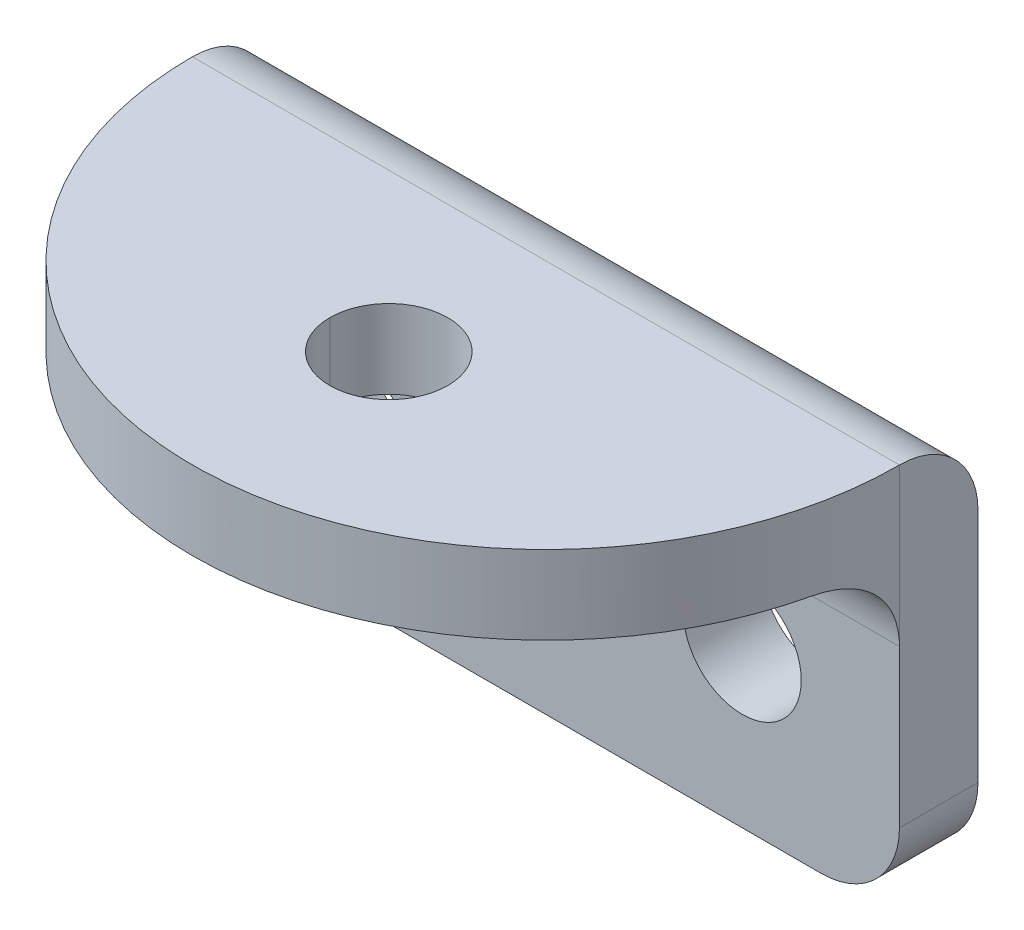
ISO-10303-21;
HEADER;
FILE_DESCRIPTION(('STEP AP214'),'2;1');
FILE_NAME('part.step','',(''),(''),'','','');
FILE_SCHEMA(('AUTOMOTIVE_DESIGN { 1 0 10303 214 1 1 1 1 }'));
ENDSEC;
DATA;
#1=APPLICATION_CONTEXT('core data for automotive mechanical design processes');
#2=APPLICATION_PROTOCOL_DEFINITION('international standard','automotive_design',2000,#1);
#3=PRODUCT_CONTEXT('',#1,'mechanical');
#4=PRODUCT('Part','Part','',(#3));
#5=PRODUCT_RELATED_PRODUCT_CATEGORY('part','',(#4));
#6=PRODUCT_DEFINITION_FORMATION('','',#4);
#7=PRODUCT_DEFINITION_CONTEXT('part definition',#1,'design');
#8=PRODUCT_DEFINITION('design','',#6,#7);
#9=PRODUCT_DEFINITION_SHAPE('','',#8);
#10=(LENGTH_UNIT() NAMED_UNIT(*) SI_UNIT(.MILLI.,.METRE.));
#11=(NAMED_UNIT(*) PLANE_ANGLE_UNIT() SI_UNIT($,.RADIAN.));
#12=(NAMED_UNIT(*) SI_UNIT($,.STERADIAN.) SOLID_ANGLE_UNIT());
#13=UNCERTAINTY_MEASURE_WITH_UNIT(LENGTH_MEASURE(1.E-05),#10,'distance_accuracy_value','');
#14=(GEOMETRIC_REPRESENTATION_CONTEXT(3) GLOBAL_UNCERTAINTY_ASSIGNED_CONTEXT((#13)) GLOBAL_UNIT_ASSIGNED_CONTEXT((#10,
#11,#12)) REPRESENTATION_CONTEXT('',''));
#15=CARTESIAN_POINT('',(0.,0.,0.));
#16=DIRECTION('',(0.,0.,1.));
#17=DIRECTION('',(1.,0.,0.));
#18=AXIS2_PLACEMENT_3D('',#15,#16,#17);
#19=CARTESIAN_POINT('',(0.,1.,0.));
#20=DIRECTION('',(0.,-1.,0.));
#21=DIRECTION('',(-1.,0.,0.));
#22=AXIS2_PLACEMENT_3D('',#19,#20,#21);
#23=CYLINDRICAL_SURFACE('',#22,9.);
#24=DIRECTION('',(0.,1.,0.));
#25=VECTOR('',#24,1.);
#26=CARTESIAN_POINT('',(-9.,1.,0.));
#27=LINE('',#26,#25);
#28=CARTESIAN_POINT('',(-9.,0.,0.));
#29=VERTEX_POINT('',#28);
#30=CARTESIAN_POINT('',(-9.,2.,0.));
#31=VERTEX_POINT('',#30);
#32=EDGE_CURVE('E139',#29,#31,#27,.T.);
#33=ORIENTED_EDGE('',*,*,#32,.F.);
#34=DIRECTION('',(0.,1.,0.));
#35=VECTOR('',#34,1.);
#36=CARTESIAN_POINT('',(-9.,-1.,0.));
#37=LINE('',#36,#35);
#38=CARTESIAN_POINT('',(-9.,-2.,0.));
#39=VERTEX_POINT('',#38);
#40=EDGE_CURVE('E142',#39,#29,#37,.T.);
#41=ORIENTED_EDGE('',*,*,#40,.F.);
#42=CARTESIAN_POINT('',(-9.,-2.,0.));
#43=CARTESIAN_POINT('',(-9.,-1.9408877817452,0.));
#44=CARTESIAN_POINT('',(-9.,-1.88177560209684,0.0021839089663973));
#45=CARTESIAN_POINT('',(-9.00000000467806,-1.82263673670032,0.00656366658157698));
#46=CARTESIAN_POINT('',(-8.99997753457232,-1.57537855117304,0.034102446830845));
#47=CARTESIAN_POINT('',(-8.99967613510836,-1.33381061421436,0.0998515414256871));
#48=CARTESIAN_POINT('',(-8.99894898717721,-1.15647216478804,0.171654970265387));
#49=CARTESIAN_POINT('',(-8.99466662045107,-0.821669913973436,0.356202372967077));
#50=CARTESIAN_POINT('',(-8.98054347110023,-0.539485062151362,0.61379829650161));
#51=CARTESIAN_POINT('',(-8.96995565845624,-0.414300831091176,0.758999824340353));
#52=CARTESIAN_POINT('',(-8.93928077081571,-0.199738499250201,1.07797120798916));
#53=CARTESIAN_POINT('',(-8.88754966926456,-0.0667548559579321,1.43632848880386));
#54=CARTESIAN_POINT('',(-8.8555939857781,-0.0220702444719247,1.62302236368879));
#55=CARTESIAN_POINT('',(-8.81779436107367,0.,1.8120842531157));
#56=CARTESIAN_POINT('',(-8.77496438739213,0.,2.));
#57=(BOUNDED_CURVE() B_SPLINE_CURVE(5,(#42,#43,#44,#45,#46,#47,#48,#49,#50,#51,#52,#53,#54,#55,
#56),.UNSPECIFIED.,.F.,.F.) B_SPLINE_CURVE_WITH_KNOTS((6,3,3,3,6),(-4.4652797792335,
-4.04729327544405,-2.70728797744066,-1.36284141727212,0.),
.UNSPECIFIED.) CURVE() GEOMETRIC_REPRESENTATION_ITEM() RATIONAL_B_SPLINE_CURVE((1.,1.,1.,1.,1.,
1.,1.,1.,1.,1.,1.,1.,1.,1.,1.)) REPRESENTATION_ITEM(''));
#58=CARTESIAN_POINT('',(-8.77496438739212,0.,2.));
#59=VERTEX_POINT('',#58);
#60=EDGE_CURVE('E28',#39,#59,#57,.T.);
#61=ORIENTED_EDGE('',*,*,#60,.T.);
#62=CARTESIAN_POINT('',(0.,0.,0.));
#63=DIRECTION('',(0.,1.,0.));
#64=DIRECTION('',(-1.,0.,0.));
#65=AXIS2_PLACEMENT_3D('',#62,#63,#64);
#66=CIRCLE('',#65,9.);
#67=CARTESIAN_POINT('',(8.77496438739212,0.,2.));
#68=VERTEX_POINT('',#67);
#69=EDGE_CURVE('E180',#59,#68,#66,.T.);
#70=ORIENTED_EDGE('',*,*,#69,.T.);
#71=CARTESIAN_POINT('',(8.77496438739212,0.,2.));
#72=CARTESIAN_POINT('',(8.8177943610738,0.,1.8120842531151));
#73=CARTESIAN_POINT('',(8.85559398577836,-0.0220702444720659,1.62302236368759));
#74=CARTESIAN_POINT('',(8.88754966926438,-0.0667548559575057,1.43632848880501));
#75=CARTESIAN_POINT('',(8.93928077081591,-0.199738499250488,1.07797120798797));
#76=CARTESIAN_POINT('',(8.96995565845653,-0.414300831093213,0.758999824337327));
#77=CARTESIAN_POINT('',(8.98054347110009,-0.539485062148762,0.613798296504025));
#78=CARTESIAN_POINT('',(8.99466662045122,-0.821669913974984,0.356202372965046));
#79=CARTESIAN_POINT('',(8.99894898717729,-1.15647216479585,0.17165497026109));
#80=CARTESIAN_POINT('',(8.99967613510837,-1.33381061420597,0.0998515414280107));
#81=CARTESIAN_POINT('',(8.99997753457232,-1.57537855116867,0.0341024468313249));
#82=CARTESIAN_POINT('',(9.00000000467806,-1.82263673670033,0.00656366658157823));
#83=CARTESIAN_POINT('',(9.,-1.88177560209685,0.00218390896639929));
#84=CARTESIAN_POINT('',(9.,-1.9408877817452,0.));
#85=CARTESIAN_POINT('',(9.,-2.,0.));
#86=(BOUNDED_CURVE() B_SPLINE_CURVE(5,(#71,#72,#73,#74,#75,#76,#77,#78,#79,#80,#81,#82,#83,#84,
#85),.UNSPECIFIED.,.F.,.F.) B_SPLINE_CURVE_WITH_KNOTS((6,3,3,3,6),(0.,1.36284141727647,
2.70728797745785,4.04729327549215,4.46527977928159),
.UNSPECIFIED.) CURVE() GEOMETRIC_REPRESENTATION_ITEM() RATIONAL_B_SPLINE_CURVE((1.,1.,1.,1.,1.,
1.,1.,1.,1.,1.,1.,1.,1.,1.,1.)) REPRESENTATION_ITEM(''));
#87=CARTESIAN_POINT('',(9.,-2.,0.));
#88=VERTEX_POINT('',#87);
#89=EDGE_CURVE('E10',#68,#88,#86,.T.);
#90=ORIENTED_EDGE('',*,*,#89,.T.);
#91=DIRECTION('',(0.,-1.,0.));
#92=VECTOR('',#91,1.);
#93=CARTESIAN_POINT('',(9.,-1.,0.));
#94=LINE('',#93,#92);
#95=CARTESIAN_POINT('',(9.,0.,0.));
#96=VERTEX_POINT('',#95);
#97=EDGE_CURVE('E209',#96,#88,#94,.T.);
#98=ORIENTED_EDGE('',*,*,#97,.F.);
#99=DIRECTION('',(0.,1.,0.));
#100=VECTOR('',#99,1.);
#101=CARTESIAN_POINT('',(9.,1.,0.));
#102=LINE('',#101,#100);
#103=CARTESIAN_POINT('',(9.,2.,0.));
#104=VERTEX_POINT('',#103);
#105=EDGE_CURVE('E213',#96,#104,#102,.T.);
#106=ORIENTED_EDGE('',*,*,#105,.T.);
#107=CARTESIAN_POINT('',(0.,2.,0.));
#108=DIRECTION('',(0.,1.,0.));
#109=DIRECTION('',(-1.,0.,0.));
#110=AXIS2_PLACEMENT_3D('',#107,#108,#109);
#111=CIRCLE('',#110,9.);
#112=EDGE_CURVE('E145',#31,#104,#111,.T.);
#113=ORIENTED_EDGE('',*,*,#112,.F.);
#114=EDGE_LOOP('',(#33,#41,#61,#70,#90,#98,#106,#113));
#115=FACE_BOUND('',#114,.T.);
#116=ADVANCED_FACE('F17',(#115),#23,.T.);
#117=CARTESIAN_POINT('',(0.,-2.,2.));
#118=DIRECTION('',(-1.,0.,0.));
#119=DIRECTION('',(0.,1.,0.));
#120=AXIS2_PLACEMENT_3D('',#117,#118,#119);
#121=CYLINDRICAL_SURFACE('',#120,2.);
#122=DIRECTION('',(1.,0.,0.));
#123=VECTOR('',#122,1.);
#124=CARTESIAN_POINT('',(0.,0.,2.));
#125=LINE('',#124,#123);
#126=EDGE_CURVE('E177',#59,#68,#125,.T.);
#127=ORIENTED_EDGE('',*,*,#126,.F.);
#128=ORIENTED_EDGE('',*,*,#60,.F.);
#129=DIRECTION('',(1.,0.,0.));
#130=VECTOR('',#129,1.);
#131=CARTESIAN_POINT('',(0.,-2.,0.));
#132=LINE('',#131,#130);
#133=EDGE_CURVE('E182',#39,#88,#132,.T.);
#134=ORIENTED_EDGE('',*,*,#133,.T.);
#135=ORIENTED_EDGE('',*,*,#89,.F.);
#136=EDGE_LOOP('',(#127,#128,#134,#135));
#137=FACE_BOUND('',#136,.T.);
#138=ADVANCED_FACE('F367',(#137),#121,.F.);
#139=CARTESIAN_POINT('',(-9.,0.,0.));
#140=DIRECTION('',(0.,0.,1.));
#141=DIRECTION('',(1.,0.,0.));
#142=AXIS2_PLACEMENT_3D('',#139,#140,#141);
#143=PLANE('',#142);
#144=CARTESIAN_POINT('',(-5.,-4.,0.));
#145=DIRECTION('',(0.,0.,1.));
#146=DIRECTION('',(1.,0.,0.));
#147=AXIS2_PLACEMENT_3D('',#144,#145,#146);
#148=CIRCLE('',#147,1.5);
#149=CARTESIAN_POINT('',(-3.5,-4.,0.));
#150=VERTEX_POINT('',#149);
#151=CARTESIAN_POINT('',(-6.5,-4.,0.));
#152=VERTEX_POINT('',#151);
#153=EDGE_CURVE('E250',#150,#152,#148,.T.);
#154=ORIENTED_EDGE('',*,*,#153,.F.);
#155=CARTESIAN_POINT('',(-5.,-4.,0.));
#156=DIRECTION('',(0.,0.,1.));
#157=DIRECTION('',(1.,0.,0.));
#158=AXIS2_PLACEMENT_3D('',#155,#156,#157);
#159=CIRCLE('',#158,1.5);
#160=EDGE_CURVE('E268',#152,#150,#159,.T.);
#161=ORIENTED_EDGE('',*,*,#160,.F.);
#162=EDGE_LOOP('',(#154,#161));
#163=FACE_BOUND('',#162,.T.);
#164=CARTESIAN_POINT('',(5.,-4.,0.));
#165=DIRECTION('',(0.,0.,1.));
#166=DIRECTION('',(1.,0.,0.));
#167=AXIS2_PLACEMENT_3D('',#164,#165,#166);
#168=CIRCLE('',#167,1.5);
#169=CARTESIAN_POINT('',(6.5,-4.,0.));
#170=VERTEX_POINT('',#169);
#171=CARTESIAN_POINT('',(3.5,-4.,0.));
#172=VERTEX_POINT('',#171);
#173=EDGE_CURVE('E281',#170,#172,#168,.T.);
#174=ORIENTED_EDGE('',*,*,#173,.F.);
#175=CARTESIAN_POINT('',(5.,-4.,0.));
#176=DIRECTION('',(0.,0.,1.));
#177=DIRECTION('',(1.,0.,0.));
#178=AXIS2_PLACEMENT_3D('',#175,#176,#177);
#179=CIRCLE('',#178,1.5);
#180=EDGE_CURVE('E306',#172,#170,#179,.T.);
#181=ORIENTED_EDGE('',*,*,#180,.F.);
#182=EDGE_LOOP('',(#174,#181));
#183=FACE_BOUND('',#182,.T.);
#184=DIRECTION('',(0.,-1.,0.));
#185=VECTOR('',#184,1.);
#186=CARTESIAN_POINT('',(-9.,-4.,0.));
#187=LINE('',#186,#185);
#188=CARTESIAN_POINT('',(-9.,-6.,0.));
#189=VERTEX_POINT('',#188);
#190=EDGE_CURVE('E156',#39,#189,#187,.T.);
#191=ORIENTED_EDGE('',*,*,#190,.T.);
#192=CARTESIAN_POINT('',(-7.,-6.,0.));
#193=DIRECTION('',(0.,0.,-1.));
#194=DIRECTION('',(1.,0.,0.));
#195=AXIS2_PLACEMENT_3D('',#192,#193,#194);
#196=CIRCLE('',#195,2.);
#197=CARTESIAN_POINT('',(-7.,-8.,0.));
#198=VERTEX_POINT('',#197);
#199=EDGE_CURVE('E174',#198,#189,#196,.T.);
#200=ORIENTED_EDGE('',*,*,#199,.F.);
#201=DIRECTION('',(1.,0.,0.));
#202=VECTOR('',#201,1.);
#203=CARTESIAN_POINT('',(0.,-8.,0.));
#204=LINE('',#203,#202);
#205=CARTESIAN_POINT('',(7.,-8.,0.));
#206=VERTEX_POINT('',#205);
#207=EDGE_CURVE('E300',#198,#206,#204,.T.);
#208=ORIENTED_EDGE('',*,*,#207,.T.);
#209=CARTESIAN_POINT('',(7.,-6.,0.));
#210=DIRECTION('',(0.,0.,-1.));
#211=DIRECTION('',(1.,0.,0.));
#212=AXIS2_PLACEMENT_3D('',#209,#210,#211);
#213=CIRCLE('',#212,2.);
#214=CARTESIAN_POINT('',(9.,-6.,0.));
#215=VERTEX_POINT('',#214);
#216=EDGE_CURVE('E230',#215,#206,#213,.T.);
#217=ORIENTED_EDGE('',*,*,#216,.F.);
#218=DIRECTION('',(0.,-1.,0.));
#219=VECTOR('',#218,1.);
#220=CARTESIAN_POINT('',(9.,-4.,0.));
#221=LINE('',#220,#219);
#222=EDGE_CURVE('E206',#88,#215,#221,.T.);
#223=ORIENTED_EDGE('',*,*,#222,.F.);
#224=ORIENTED_EDGE('',*,*,#133,.F.);
#225=EDGE_LOOP('',(#191,#200,#208,#217,#223,#224));
#226=FACE_BOUND('',#225,.T.);
#227=ADVANCED_FACE('F359',(#163,#183,#226),#143,.T.);
#228=CARTESIAN_POINT('',(0.,0.,0.));
#229=DIRECTION('',(0.,1.,0.));
#230=DIRECTION('',(-1.,0.,0.));
#231=AXIS2_PLACEMENT_3D('',#228,#229,#230);
#232=PLANE('',#231);
#233=CARTESIAN_POINT('',(0.,0.,4.));
#234=DIRECTION('',(0.,1.,0.));
#235=DIRECTION('',(-1.,0.,0.));
#236=AXIS2_PLACEMENT_3D('',#233,#234,#235);
#237=CIRCLE('',#236,1.5);
#238=CARTESIAN_POINT('',(-1.5,0.,4.));
#239=VERTEX_POINT('',#238);
#240=CARTESIAN_POINT('',(1.5,0.,4.));
#241=VERTEX_POINT('',#240);
#242=EDGE_CURVE('E262',#239,#241,#237,.T.);
#243=ORIENTED_EDGE('',*,*,#242,.T.);
#244=CARTESIAN_POINT('',(0.,0.,4.));
#245=DIRECTION('',(0.,1.,0.));
#246=DIRECTION('',(-1.,0.,0.));
#247=AXIS2_PLACEMENT_3D('',#244,#245,#246);
#248=CIRCLE('',#247,1.5);
#249=EDGE_CURVE('E267',#241,#239,#248,.T.);
#250=ORIENTED_EDGE('',*,*,#249,.T.);
#251=EDGE_LOOP('',(#243,#250));
#252=FACE_BOUND('',#251,.T.);
#253=ORIENTED_EDGE('',*,*,#126,.T.);
#254=ORIENTED_EDGE('',*,*,#69,.F.);
#255=EDGE_LOOP('',(#253,#254));
#256=FACE_BOUND('',#255,.T.);
#257=ADVANCED_FACE('F366',(#252,#256),#232,.F.);
#258=CARTESIAN_POINT('',(-7.,-6.,-1.));
#259=DIRECTION('',(0.,0.,-1.));
#260=DIRECTION('',(0.,-1.,0.));
#261=AXIS2_PLACEMENT_3D('',#258,#259,#260);
#262=CYLINDRICAL_SURFACE('',#261,2.);
#263=ORIENTED_EDGE('',*,*,#199,.T.);
#264=DIRECTION('',(0.,0.,1.));
#265=VECTOR('',#264,1.);
#266=CARTESIAN_POINT('',(-9.,-6.,-1.));
#267=LINE('',#266,#265);
#268=CARTESIAN_POINT('',(-9.,-6.,-2.));
#269=VERTEX_POINT('',#268);
#270=EDGE_CURVE('E163',#269,#189,#267,.T.);
#271=ORIENTED_EDGE('',*,*,#270,.F.);
#272=CARTESIAN_POINT('',(-7.,-6.,-2.));
#273=DIRECTION('',(0.,0.,1.));
#274=DIRECTION('',(1.,0.,0.));
#275=AXIS2_PLACEMENT_3D('',#272,#273,#274);
#276=CIRCLE('',#275,2.);
#277=CARTESIAN_POINT('',(-7.,-8.,-2.));
#278=VERTEX_POINT('',#277);
#279=EDGE_CURVE('E171',#269,#278,#276,.T.);
#280=ORIENTED_EDGE('',*,*,#279,.T.);
#281=DIRECTION('',(0.,0.,1.));
#282=VECTOR('',#281,1.);
#283=CARTESIAN_POINT('',(-7.,-8.,-1.));
#284=LINE('',#283,#282);
#285=EDGE_CURVE('E199',#278,#198,#284,.T.);
#286=ORIENTED_EDGE('',*,*,#285,.T.);
#287=EDGE_LOOP('',(#263,#271,#280,#286));
#288=FACE_BOUND('',#287,.T.);
#289=ADVANCED_FACE('F377',(#288),#262,.T.);
#290=CARTESIAN_POINT('',(-9.,2.,-2.));
#291=DIRECTION('',(0.,0.,-1.));
#292=DIRECTION('',(1.,0.,0.));
#293=AXIS2_PLACEMENT_3D('',#290,#291,#292);
#294=PLANE('',#293);
#295=CARTESIAN_POINT('',(-5.,-4.,-2.));
#296=DIRECTION('',(0.,0.,-1.));
#297=DIRECTION('',(1.,0.,0.));
#298=AXIS2_PLACEMENT_3D('',#295,#296,#297);
#299=CIRCLE('',#298,1.5);
#300=CARTESIAN_POINT('',(-6.5,-4.,-2.));
#301=VERTEX_POINT('',#300);
#302=CARTESIAN_POINT('',(-3.5,-4.,-2.));
#303=VERTEX_POINT('',#302);
#304=EDGE_CURVE('E254',#301,#303,#299,.T.);
#305=ORIENTED_EDGE('',*,*,#304,.F.);
#306=CARTESIAN_POINT('',(-5.,-4.,-2.));
#307=DIRECTION('',(0.,0.,-1.));
#308=DIRECTION('',(1.,0.,0.));
#309=AXIS2_PLACEMENT_3D('',#306,#307,#308);
#310=CIRCLE('',#309,1.5);
#311=EDGE_CURVE('E292',#303,#301,#310,.T.);
#312=ORIENTED_EDGE('',*,*,#311,.F.);
#313=EDGE_LOOP('',(#305,#312));
#314=FACE_BOUND('',#313,.T.);
#315=CARTESIAN_POINT('',(5.,-4.,-2.));
#316=DIRECTION('',(0.,0.,-1.));
#317=DIRECTION('',(1.,0.,0.));
#318=AXIS2_PLACEMENT_3D('',#315,#316,#317);
#319=CIRCLE('',#318,1.5);
#320=CARTESIAN_POINT('',(3.5,-4.,-2.));
#321=VERTEX_POINT('',#320);
#322=CARTESIAN_POINT('',(6.5,-4.,-2.));
#323=VERTEX_POINT('',#322);
#324=EDGE_CURVE('E285',#321,#323,#319,.T.);
#325=ORIENTED_EDGE('',*,*,#324,.F.);
#326=CARTESIAN_POINT('',(5.,-4.,-2.));
#327=DIRECTION('',(0.,0.,-1.));
#328=DIRECTION('',(1.,0.,0.));
#329=AXIS2_PLACEMENT_3D('',#326,#327,#328);
#330=CIRCLE('',#329,1.5);
#331=EDGE_CURVE('E318',#323,#321,#330,.T.);
#332=ORIENTED_EDGE('',*,*,#331,.F.);
#333=EDGE_LOOP('',(#325,#332));
#334=FACE_BOUND('',#333,.T.);
#335=DIRECTION('',(0.,-1.,0.));
#336=VECTOR('',#335,1.);
#337=CARTESIAN_POINT('',(-9.,-3.,-2.));
#338=LINE('',#337,#336);
#339=CARTESIAN_POINT('',(-9.,0.,-2.));
#340=VERTEX_POINT('',#339);
#341=EDGE_CURVE('E150',#340,#269,#338,.T.);
#342=ORIENTED_EDGE('',*,*,#341,.F.);
#343=DIRECTION('',(-1.,0.,0.));
#344=VECTOR('',#343,1.);
#345=CARTESIAN_POINT('',(0.,0.,-2.));
#346=LINE('',#345,#344);
#347=CARTESIAN_POINT('',(9.,0.,-2.));
#348=VERTEX_POINT('',#347);
#349=EDGE_CURVE('E195',#348,#340,#346,.T.);
#350=ORIENTED_EDGE('',*,*,#349,.F.);
#351=DIRECTION('',(0.,-1.,0.));
#352=VECTOR('',#351,1.);
#353=CARTESIAN_POINT('',(9.,-3.,-2.));
#354=LINE('',#353,#352);
#355=CARTESIAN_POINT('',(9.,-6.,-2.));
#356=VERTEX_POINT('',#355);
#357=EDGE_CURVE('E203',#348,#356,#354,.T.);
#358=ORIENTED_EDGE('',*,*,#357,.T.);
#359=CARTESIAN_POINT('',(7.,-6.,-2.));
#360=DIRECTION('',(0.,0.,1.));
#361=DIRECTION('',(1.,0.,0.));
#362=AXIS2_PLACEMENT_3D('',#359,#360,#361);
#363=CIRCLE('',#362,2.);
#364=CARTESIAN_POINT('',(7.,-8.,-2.));
#365=VERTEX_POINT('',#364);
#366=EDGE_CURVE('E243',#365,#356,#363,.T.);
#367=ORIENTED_EDGE('',*,*,#366,.F.);
#368=DIRECTION('',(-1.,0.,0.));
#369=VECTOR('',#368,1.);
#370=CARTESIAN_POINT('',(0.,-8.,-2.));
#371=LINE('',#370,#369);
#372=EDGE_CURVE('E167',#365,#278,#371,.T.);
#373=ORIENTED_EDGE('',*,*,#372,.T.);
#374=ORIENTED_EDGE('',*,*,#279,.F.);
#375=EDGE_LOOP('',(#342,#350,#358,#367,#373,#374));
#376=FACE_BOUND('',#375,.T.);
#377=ADVANCED_FACE('F339',(#314,#334,#376),#294,.T.);
#378=CARTESIAN_POINT('',(-9.,2.,-2.));
#379=DIRECTION('',(1.,0.,0.));
#380=DIRECTION('',(0.,0.,1.));
#381=AXIS2_PLACEMENT_3D('',#378,#379,#380);
#382=PLANE('',#381);
#383=ORIENTED_EDGE('',*,*,#270,.T.);
#384=ORIENTED_EDGE('',*,*,#190,.F.);
#385=ORIENTED_EDGE('',*,*,#40,.T.);
#386=ORIENTED_EDGE('',*,*,#32,.T.);
#387=CARTESIAN_POINT('',(-9.,0.,0.));
#388=DIRECTION('',(1.,0.,0.));
#389=DIRECTION('',(0.,0.,1.));
#390=AXIS2_PLACEMENT_3D('',#387,#388,#389);
#391=CIRCLE('',#390,2.);
#392=EDGE_CURVE('E200',#340,#31,#391,.T.);
#393=ORIENTED_EDGE('',*,*,#392,.F.);
#394=ORIENTED_EDGE('',*,*,#341,.T.);
#395=EDGE_LOOP('',(#383,#384,#385,#386,#393,#394));
#396=FACE_BOUND('',#395,.T.);
#397=ADVANCED_FACE('F154',(#396),#382,.F.);
#398=CARTESIAN_POINT('',(0.,-8.,0.));
#399=DIRECTION('',(0.,1.,0.));
#400=DIRECTION('',(-1.,0.,0.));
#401=AXIS2_PLACEMENT_3D('',#398,#399,#400);
#402=PLANE('',#401);
#403=ORIENTED_EDGE('',*,*,#285,.F.);
#404=ORIENTED_EDGE('',*,*,#372,.F.);
#405=DIRECTION('',(0.,0.,-1.));
#406=VECTOR('',#405,1.);
#407=CARTESIAN_POINT('',(7.,-8.,-1.));
#408=LINE('',#407,#406);
#409=EDGE_CURVE('E226',#206,#365,#408,.T.);
#410=ORIENTED_EDGE('',*,*,#409,.F.);
#411=ORIENTED_EDGE('',*,*,#207,.F.);
#412=EDGE_LOOP('',(#403,#404,#410,#411));
#413=FACE_BOUND('',#412,.T.);
#414=ADVANCED_FACE('F382',(#413),#402,.F.);
#415=CARTESIAN_POINT('',(0.,0.,0.));
#416=DIRECTION('',(-1.,0.,0.));
#417=DIRECTION('',(0.,0.,-1.));
#418=AXIS2_PLACEMENT_3D('',#415,#416,#417);
#419=CYLINDRICAL_SURFACE('',#418,2.);
#420=ORIENTED_EDGE('',*,*,#392,.T.);
#421=DIRECTION('',(-1.,0.,0.));
#422=VECTOR('',#421,1.);
#423=CARTESIAN_POINT('',(0.,2.,0.));
#424=LINE('',#423,#422);
#425=EDGE_CURVE('E220',#104,#31,#424,.T.);
#426=ORIENTED_EDGE('',*,*,#425,.F.);
#427=CARTESIAN_POINT('',(9.,0.,0.));
#428=DIRECTION('',(-1.,0.,0.));
#429=DIRECTION('',(0.,0.,-1.));
#430=AXIS2_PLACEMENT_3D('',#427,#428,#429);
#431=CIRCLE('',#430,2.);
#432=EDGE_CURVE('E216',#104,#348,#431,.T.);
#433=ORIENTED_EDGE('',*,*,#432,.T.);
#434=ORIENTED_EDGE('',*,*,#349,.T.);
#435=EDGE_LOOP('',(#420,#426,#433,#434));
#436=FACE_BOUND('',#435,.T.);
#437=ADVANCED_FACE('F399',(#436),#419,.T.);
#438=CARTESIAN_POINT('',(9.,2.,0.));
#439=DIRECTION('',(-1.,0.,0.));
#440=DIRECTION('',(0.,0.,-1.));
#441=AXIS2_PLACEMENT_3D('',#438,#439,#440);
#442=PLANE('',#441);
#443=ORIENTED_EDGE('',*,*,#432,.F.);
#444=ORIENTED_EDGE('',*,*,#105,.F.);
#445=ORIENTED_EDGE('',*,*,#97,.T.);
#446=ORIENTED_EDGE('',*,*,#222,.T.);
#447=DIRECTION('',(0.,0.,-1.));
#448=VECTOR('',#447,1.);
#449=CARTESIAN_POINT('',(9.,-6.,-1.));
#450=LINE('',#449,#448);
#451=EDGE_CURVE('E233',#215,#356,#450,.T.);
#452=ORIENTED_EDGE('',*,*,#451,.T.);
#453=ORIENTED_EDGE('',*,*,#357,.F.);
#454=EDGE_LOOP('',(#443,#444,#445,#446,#452,#453));
#455=FACE_BOUND('',#454,.T.);
#456=ADVANCED_FACE('F394',(#455),#442,.F.);
#457=CARTESIAN_POINT('',(0.,2.,0.));
#458=DIRECTION('',(0.,1.,0.));
#459=DIRECTION('',(-1.,0.,0.));
#460=AXIS2_PLACEMENT_3D('',#457,#458,#459);
#461=PLANE('',#460);
#462=CARTESIAN_POINT('',(0.,2.,4.));
#463=DIRECTION('',(0.,1.,0.));
#464=DIRECTION('',(-1.,0.,0.));
#465=AXIS2_PLACEMENT_3D('',#462,#463,#464);
#466=CIRCLE('',#465,1.5);
#467=CARTESIAN_POINT('',(-1.5,2.,4.));
#468=VERTEX_POINT('',#467);
#469=CARTESIAN_POINT('',(1.5,2.,4.));
#470=VERTEX_POINT('',#469);
#471=EDGE_CURVE('E258',#468,#470,#466,.T.);
#472=ORIENTED_EDGE('',*,*,#471,.F.);
#473=CARTESIAN_POINT('',(0.,2.,4.));
#474=DIRECTION('',(0.,1.,0.));
#475=DIRECTION('',(-1.,0.,0.));
#476=AXIS2_PLACEMENT_3D('',#473,#474,#475);
#477=CIRCLE('',#476,1.5);
#478=EDGE_CURVE('E277',#470,#468,#477,.T.);
#479=ORIENTED_EDGE('',*,*,#478,.F.);
#480=EDGE_LOOP('',(#472,#479));
#481=FACE_BOUND('',#480,.T.);
#482=ORIENTED_EDGE('',*,*,#112,.T.);
#483=ORIENTED_EDGE('',*,*,#425,.T.);
#484=EDGE_LOOP('',(#482,#483));
#485=FACE_BOUND('',#484,.T.);
#486=ADVANCED_FACE('F402',(#481,#485),#461,.T.);
#487=CARTESIAN_POINT('',(7.,-6.,-1.));
#488=DIRECTION('',(0.,0.,1.));
#489=DIRECTION('',(0.,-1.,0.));
#490=AXIS2_PLACEMENT_3D('',#487,#488,#489);
#491=CYLINDRICAL_SURFACE('',#490,2.);
#492=ORIENTED_EDGE('',*,*,#366,.T.);
#493=ORIENTED_EDGE('',*,*,#451,.F.);
#494=ORIENTED_EDGE('',*,*,#216,.T.);
#495=ORIENTED_EDGE('',*,*,#409,.T.);
#496=EDGE_LOOP('',(#492,#493,#494,#495));
#497=FACE_BOUND('',#496,.T.);
#498=ADVANCED_FACE('F388',(#497),#491,.T.);
#499=CARTESIAN_POINT('',(-5.,-4.,-1.66000000006));
#500=DIRECTION('',(0.,0.,-1.));
#501=DIRECTION('',(1.,0.,0.));
#502=AXIS2_PLACEMENT_3D('',#499,#500,#501);
#503=CYLINDRICAL_SURFACE('',#502,1.5);
#504=ORIENTED_EDGE('',*,*,#304,.T.);
#505=DIRECTION('',(0.,0.,-1.));
#506=VECTOR('',#505,1.);
#507=CARTESIAN_POINT('',(-3.5,-4.,-1.66000000006));
#508=LINE('',#507,#506);
#509=EDGE_CURVE('E257',#150,#303,#508,.T.);
#510=ORIENTED_EDGE('',*,*,#509,.F.);
#511=ORIENTED_EDGE('',*,*,#153,.T.);
#512=DIRECTION('',(0.,0.,-1.));
#513=VECTOR('',#512,1.);
#514=CARTESIAN_POINT('',(-6.5,-4.,-1.66000000006));
#515=LINE('',#514,#513);
#516=EDGE_CURVE('E272',#152,#301,#515,.T.);
#517=ORIENTED_EDGE('',*,*,#516,.T.);
#518=EDGE_LOOP('',(#504,#510,#511,#517));
#519=FACE_BOUND('',#518,.T.);
#520=ADVANCED_FACE('F414',(#519),#503,.F.);
#521=CARTESIAN_POINT('',(-5.,-4.,-1.66000000006));
#522=DIRECTION('',(0.,0.,-1.));
#523=DIRECTION('',(1.,0.,0.));
#524=AXIS2_PLACEMENT_3D('',#521,#522,#523);
#525=CYLINDRICAL_SURFACE('',#524,1.5);
#526=ORIENTED_EDGE('',*,*,#311,.T.);
#527=ORIENTED_EDGE('',*,*,#516,.F.);
#528=ORIENTED_EDGE('',*,*,#160,.T.);
#529=ORIENTED_EDGE('',*,*,#509,.T.);
#530=EDGE_LOOP('',(#526,#527,#528,#529));
#531=FACE_BOUND('',#530,.T.);
#532=ADVANCED_FACE('F429',(#531),#525,.F.);
#533=CARTESIAN_POINT('',(0.,1.,4.));
#534=DIRECTION('',(0.,-1.,0.));
#535=DIRECTION('',(-1.,0.,0.));
#536=AXIS2_PLACEMENT_3D('',#533,#534,#535);
#537=CYLINDRICAL_SURFACE('',#536,1.5);
#538=ORIENTED_EDGE('',*,*,#471,.T.);
#539=DIRECTION('',(0.,1.,0.));
#540=VECTOR('',#539,1.);
#541=CARTESIAN_POINT('',(1.5,1.,4.));
#542=LINE('',#541,#540);
#543=EDGE_CURVE('E263',#241,#470,#542,.T.);
#544=ORIENTED_EDGE('',*,*,#543,.F.);
#545=ORIENTED_EDGE('',*,*,#242,.F.);
#546=DIRECTION('',(0.,1.,0.));
#547=VECTOR('',#546,1.);
#548=CARTESIAN_POINT('',(-1.5,1.,4.));
#549=LINE('',#548,#547);
#550=EDGE_CURVE('E273',#239,#468,#549,.T.);
#551=ORIENTED_EDGE('',*,*,#550,.T.);
#552=EDGE_LOOP('',(#538,#544,#545,#551));
#553=FACE_BOUND('',#552,.T.);
#554=ADVANCED_FACE('F427',(#553),#537,.F.);
#555=CARTESIAN_POINT('',(0.,1.,4.));
#556=DIRECTION('',(0.,-1.,0.));
#557=DIRECTION('',(-1.,0.,0.));
#558=AXIS2_PLACEMENT_3D('',#555,#556,#557);
#559=CYLINDRICAL_SURFACE('',#558,1.5);
#560=ORIENTED_EDGE('',*,*,#478,.T.);
#561=ORIENTED_EDGE('',*,*,#550,.F.);
#562=ORIENTED_EDGE('',*,*,#249,.F.);
#563=ORIENTED_EDGE('',*,*,#543,.T.);
#564=EDGE_LOOP('',(#560,#561,#562,#563));
#565=FACE_BOUND('',#564,.T.);
#566=ADVANCED_FACE('F512',(#565),#559,.F.);
#567=CARTESIAN_POINT('',(5.,-4.,-1.66000000006));
#568=DIRECTION('',(0.,0.,-1.));
#569=DIRECTION('',(1.,0.,0.));
#570=AXIS2_PLACEMENT_3D('',#567,#568,#569);
#571=CYLINDRICAL_SURFACE('',#570,1.5);
#572=ORIENTED_EDGE('',*,*,#324,.T.);
#573=DIRECTION('',(0.,0.,-1.));
#574=VECTOR('',#573,1.);
#575=CARTESIAN_POINT('',(6.5,-4.,-1.66000000006));
#576=LINE('',#575,#574);
#577=EDGE_CURVE('E296',#170,#323,#576,.T.);
#578=ORIENTED_EDGE('',*,*,#577,.F.);
#579=ORIENTED_EDGE('',*,*,#173,.T.);
#580=DIRECTION('',(0.,0.,-1.));
#581=VECTOR('',#580,1.);
#582=CARTESIAN_POINT('',(3.5,-4.,-1.66000000006));
#583=LINE('',#582,#581);
#584=EDGE_CURVE('E314',#172,#321,#583,.T.);
#585=ORIENTED_EDGE('',*,*,#584,.T.);
#586=EDGE_LOOP('',(#572,#578,#579,#585));
#587=FACE_BOUND('',#586,.T.);
#588=ADVANCED_FACE('F356',(#587),#571,.F.);
#589=CARTESIAN_POINT('',(5.,-4.,-1.66000000006));
#590=DIRECTION('',(0.,0.,-1.));
#591=DIRECTION('',(1.,0.,0.));
#592=AXIS2_PLACEMENT_3D('',#589,#590,#591);
#593=CYLINDRICAL_SURFACE('',#592,1.5);
#594=ORIENTED_EDGE('',*,*,#331,.T.);
#595=ORIENTED_EDGE('',*,*,#584,.F.);
#596=ORIENTED_EDGE('',*,*,#180,.T.);
#597=ORIENTED_EDGE('',*,*,#577,.T.);
#598=EDGE_LOOP('',(#594,#595,#596,#597));
#599=FACE_BOUND('',#598,.T.);
#600=ADVANCED_FACE('F331',(#599),#593,.F.);
#601=CLOSED_SHELL('',(#116,#138,#227,#257,#289,#377,#397,#414,#437,#456,#486,#498,#520,#532,
#554,#566,#588,#600));
#602=MANIFOLD_SOLID_BREP('B1',#601);
#603=ADVANCED_BREP_SHAPE_REPRESENTATION('',(#18,#602),#14);
#604=SHAPE_DEFINITION_REPRESENTATION(#9,#603);
ENDSEC;
END-ISO-10303-21;
